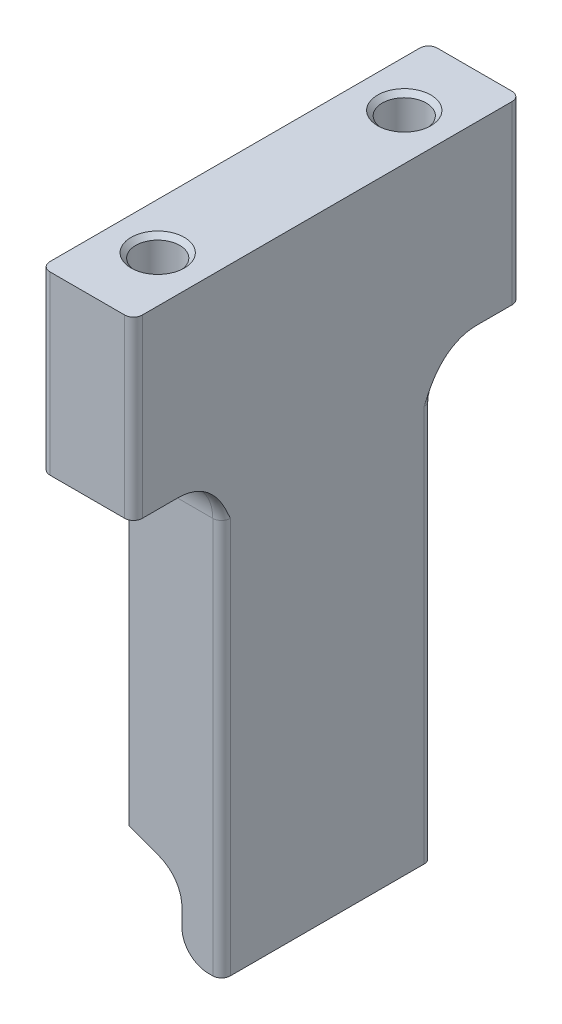
ISO-10303-21;
HEADER;
FILE_DESCRIPTION(('STEP AP214'),'2;1');
FILE_NAME('part.step','',(''),(''),'','','');
FILE_SCHEMA(('AUTOMOTIVE_DESIGN { 1 0 10303 214 1 1 1 1 }'));
ENDSEC;
DATA;
#1=APPLICATION_CONTEXT('core data for automotive mechanical design processes');
#2=APPLICATION_PROTOCOL_DEFINITION('international standard','automotive_design',2000,#1);
#3=PRODUCT_CONTEXT('',#1,'mechanical');
#4=PRODUCT('Part','Part','',(#3));
#5=PRODUCT_RELATED_PRODUCT_CATEGORY('part','',(#4));
#6=PRODUCT_DEFINITION_FORMATION('','',#4);
#7=PRODUCT_DEFINITION_CONTEXT('part definition',#1,'design');
#8=PRODUCT_DEFINITION('design','',#6,#7);
#9=PRODUCT_DEFINITION_SHAPE('','',#8);
#10=(LENGTH_UNIT() NAMED_UNIT(*) SI_UNIT(.MILLI.,.METRE.));
#11=(NAMED_UNIT(*) PLANE_ANGLE_UNIT() SI_UNIT($,.RADIAN.));
#12=(NAMED_UNIT(*) SI_UNIT($,.STERADIAN.) SOLID_ANGLE_UNIT());
#13=UNCERTAINTY_MEASURE_WITH_UNIT(LENGTH_MEASURE(1.E-05),#10,'distance_accuracy_value','');
#14=(GEOMETRIC_REPRESENTATION_CONTEXT(3) GLOBAL_UNCERTAINTY_ASSIGNED_CONTEXT((#13)) GLOBAL_UNIT_ASSIGNED_CONTEXT((#10,
#11,#12)) REPRESENTATION_CONTEXT('',''));
#15=CARTESIAN_POINT('',(0.,0.,0.));
#16=DIRECTION('',(0.,0.,1.));
#17=DIRECTION('',(1.,0.,0.));
#18=AXIS2_PLACEMENT_3D('',#15,#16,#17);
#19=CARTESIAN_POINT('',(5.25,-70.,12.));
#20=DIRECTION('',(1.,0.,0.));
#21=DIRECTION('',(0.,0.,-1.));
#22=AXIS2_PLACEMENT_3D('',#19,#20,#21);
#23=PLANE('',#22);
#24=DIRECTION('',(0.,0.,-1.));
#25=VECTOR('',#24,1.);
#26=CARTESIAN_POINT('',(5.25,-20.,22.));
#27=LINE('',#26,#25);
#28=CARTESIAN_POINT('',(5.25,-20.,-16.9160797830996));
#29=VERTEX_POINT('',#28);
#30=CARTESIAN_POINT('',(5.25,-20.,-21.));
#31=VERTEX_POINT('',#30);
#32=EDGE_CURVE('E232',#29,#31,#27,.T.);
#33=ORIENTED_EDGE('',*,*,#32,.T.);
#34=DIRECTION('',(0.,1.,0.));
#35=VECTOR('',#34,1.);
#36=CARTESIAN_POINT('',(5.25,-70.,-21.));
#37=LINE('',#36,#35);
#38=CARTESIAN_POINT('',(5.25,0.,-21.));
#39=VERTEX_POINT('',#38);
#40=EDGE_CURVE('E398',#31,#39,#37,.T.);
#41=ORIENTED_EDGE('',*,*,#40,.T.);
#42=DIRECTION('',(0.,0.,-1.));
#43=VECTOR('',#42,1.);
#44=CARTESIAN_POINT('',(5.25,0.,12.));
#45=LINE('',#44,#43);
#46=CARTESIAN_POINT('',(5.25,0.,21.));
#47=VERTEX_POINT('',#46);
#48=EDGE_CURVE('E262',#47,#39,#45,.T.);
#49=ORIENTED_EDGE('',*,*,#48,.F.);
#50=DIRECTION('',(0.,1.,0.));
#51=VECTOR('',#50,1.);
#52=CARTESIAN_POINT('',(5.25,-70.,21.));
#53=LINE('',#52,#51);
#54=CARTESIAN_POINT('',(5.25,-20.,21.));
#55=VERTEX_POINT('',#54);
#56=EDGE_CURVE('E407',#47,#55,#53,.F.);
#57=ORIENTED_EDGE('',*,*,#56,.T.);
#58=CARTESIAN_POINT('',(5.25,-20.,16.9160797830996));
#59=VERTEX_POINT('',#58);
#60=EDGE_CURVE('E233',#55,#59,#27,.T.);
#61=ORIENTED_EDGE('',*,*,#60,.T.);
#62=CARTESIAN_POINT('',(5.25,-20.,16.9160797830996));
#63=CARTESIAN_POINT('',(5.25,-19.9999894901637,16.7891695359213));
#64=CARTESIAN_POINT('',(5.25,-20.0046970896311,16.6622657436725));
#65=CARTESIAN_POINT('',(5.25,-20.0234197172249,16.4091760112215));
#66=CARTESIAN_POINT('',(5.25,-20.0374325325279,16.2829899075432));
#67=CARTESIAN_POINT('',(5.25,-20.0746133928977,16.0321382318218));
#68=CARTESIAN_POINT('',(5.25,-20.0977698376197,15.9074709386826));
#69=CARTESIAN_POINT('',(5.25,-20.1530395735266,15.6601280415763));
#70=CARTESIAN_POINT('',(5.25,-20.185153932505,15.5374526768954));
#71=CARTESIAN_POINT('',(5.25,-20.2637105050361,15.2760107259621));
#72=CARTESIAN_POINT('',(5.25,-20.3115977571874,15.1376763074849));
#73=CARTESIAN_POINT('',(5.25,-20.4185117721562,14.8653178215435));
#74=CARTESIAN_POINT('',(5.25,-20.4775437349829,14.7312958005043));
#75=CARTESIAN_POINT('',(5.25,-20.6061821958586,14.4683767448541));
#76=CARTESIAN_POINT('',(5.25,-20.6757921594758,14.339481407375));
#77=CARTESIAN_POINT('',(5.25,-20.8248846333417,14.0876061526278));
#78=CARTESIAN_POINT('',(5.25,-20.9043635997168,13.9646241338185));
#79=CARTESIAN_POINT('',(5.25,-21.0766525358194,13.719155163343));
#80=CARTESIAN_POINT('',(5.25,-21.1699281389003,13.5969951979272));
#81=CARTESIAN_POINT('',(5.25,-21.3656448948461,13.360262363442));
#82=CARTESIAN_POINT('',(5.25,-21.4680865077264,13.2456898756687));
#83=CARTESIAN_POINT('',(5.25,-21.6811413825091,13.0244401523157));
#84=CARTESIAN_POINT('',(5.25,-21.7917542565157,12.917762542441));
#85=CARTESIAN_POINT('',(5.25,-22.020102906717,12.7123795001146));
#86=CARTESIAN_POINT('',(5.25,-22.1378383083502,12.6136736490781));
#87=CARTESIAN_POINT('',(5.25,-22.4617725369814,12.3594319148424));
#88=CARTESIAN_POINT('',(5.25,-22.6735779800598,12.2110094388895));
#89=CARTESIAN_POINT('',(5.25,-23.1093908502497,11.9338674346655));
#90=CARTESIAN_POINT('',(5.25,-23.3333957918585,11.8051439131775));
#91=CARTESIAN_POINT('',(5.25,-23.7607716798599,11.5776576901539));
#92=CARTESIAN_POINT('',(5.25,-23.9632380899574,11.477160192975));
#93=CARTESIAN_POINT('',(5.25,-24.3714755228196,11.2831245387175));
#94=CARTESIAN_POINT('',(5.25000000000001,-24.5772473138215,11.1895880288219));
#95=CARTESIAN_POINT('',(5.25,-24.8512847355008,11.0665151322438));
#96=CARTESIAN_POINT('',(5.25,-24.9191859075108,11.0361416208077));
#97=CARTESIAN_POINT('',(5.25,-24.9913933692119,11.003849004667));
#98=CARTESIAN_POINT('',(5.25,-24.9956966838616,11.0019245037049));
#99=CARTESIAN_POINT('',(5.25,-25.,11.));
#100=B_SPLINE_CURVE_WITH_KNOTS('',3,(#62,#63,#64,#65,#66,#67,#68,#69,#70,#71,#72,#73,#74,#75,
#76,#77,#78,#79,#80,#81,#82,#83,#84,#85,#86,#87,#88,#89,#90,#91,#92,#93,#94,#95,#96,#97,#98,
#99),.UNSPECIFIED.,.F.,.F.,(4,2,2,2,2,2,2,2,2,2,2,2,2,2,2,2,2,2,4),(0.,0.380633696246959,
0.761176908442176,1.14123887609861,1.52134616694543,1.96000481777713,2.39886865041611,
2.83787657499773,3.2767273090638,3.73734073447595,4.19797728972743,4.65859199225861,
5.11918249286643,5.89366486615118,6.66799003390906,7.34588228650388,8.02393444246643,
8.24709091180318,8.26123304742583),.UNSPECIFIED.);
#101=CARTESIAN_POINT('',(5.25,-25.,11.));
#102=VERTEX_POINT('',#101);
#103=EDGE_CURVE('E337',#59,#102,#100,.T.);
#104=ORIENTED_EDGE('',*,*,#103,.T.);
#105=DIRECTION('',(0.,1.,0.));
#106=VECTOR('',#105,1.);
#107=CARTESIAN_POINT('',(5.25,-70.,11.));
#108=LINE('',#107,#106);
#109=CARTESIAN_POINT('',(5.25,-70.,11.));
#110=VERTEX_POINT('',#109);
#111=EDGE_CURVE('E296',#102,#110,#108,.F.);
#112=ORIENTED_EDGE('',*,*,#111,.T.);
#113=DIRECTION('',(0.,0.,-1.));
#114=VECTOR('',#113,1.);
#115=CARTESIAN_POINT('',(5.25,-70.,12.));
#116=LINE('',#115,#114);
#117=CARTESIAN_POINT('',(5.25,-70.,-11.));
#118=VERTEX_POINT('',#117);
#119=EDGE_CURVE('E267',#110,#118,#116,.T.);
#120=ORIENTED_EDGE('',*,*,#119,.T.);
#121=DIRECTION('',(0.,1.,0.));
#122=VECTOR('',#121,1.);
#123=CARTESIAN_POINT('',(5.25,-70.,-11.));
#124=LINE('',#123,#122);
#125=CARTESIAN_POINT('',(5.25,-25.,-11.));
#126=VERTEX_POINT('',#125);
#127=EDGE_CURVE('E298',#118,#126,#124,.T.);
#128=ORIENTED_EDGE('',*,*,#127,.T.);
#129=CARTESIAN_POINT('',(5.25,-20.,-16.9160797830996));
#130=CARTESIAN_POINT('',(5.25,-19.9999894901637,-16.7891695359213));
#131=CARTESIAN_POINT('',(5.25,-20.0046970896311,-16.6622657436725));
#132=CARTESIAN_POINT('',(5.25,-20.0234197172249,-16.4091760112215));
#133=CARTESIAN_POINT('',(5.25,-20.0374325325279,-16.2829899075432));
#134=CARTESIAN_POINT('',(5.25,-20.0746133928977,-16.0321382318218));
#135=CARTESIAN_POINT('',(5.25,-20.0977698376197,-15.9074709386826));
#136=CARTESIAN_POINT('',(5.25,-20.1530395735266,-15.6601280415764));
#137=CARTESIAN_POINT('',(5.25,-20.185153932505,-15.5374526768954));
#138=CARTESIAN_POINT('',(5.25,-20.2637105050361,-15.2760107259621));
#139=CARTESIAN_POINT('',(5.25,-20.3115977571874,-15.1376763074849));
#140=CARTESIAN_POINT('',(5.25,-20.4185117721562,-14.8653178215435));
#141=CARTESIAN_POINT('',(5.25,-20.4775437349829,-14.7312958005043));
#142=CARTESIAN_POINT('',(5.25,-20.6061821958586,-14.4683767448541));
#143=CARTESIAN_POINT('',(5.25,-20.6757921594758,-14.339481407375));
#144=CARTESIAN_POINT('',(5.25,-20.8248846333417,-14.0876061526278));
#145=CARTESIAN_POINT('',(5.25,-20.9043635997168,-13.9646241338185));
#146=CARTESIAN_POINT('',(5.25,-21.0766525358194,-13.719155163343));
#147=CARTESIAN_POINT('',(5.25,-21.1699281389003,-13.5969951979272));
#148=CARTESIAN_POINT('',(5.25,-21.365644894846,-13.360262363442));
#149=CARTESIAN_POINT('',(5.25,-21.4680865077264,-13.2456898756688));
#150=CARTESIAN_POINT('',(5.25,-21.6811413825091,-13.0244401523158));
#151=CARTESIAN_POINT('',(5.25,-21.7917542565157,-12.917762542441));
#152=CARTESIAN_POINT('',(5.25,-22.020102906717,-12.7123795001146));
#153=CARTESIAN_POINT('',(5.25,-22.1378383083502,-12.6136736490781));
#154=CARTESIAN_POINT('',(5.25,-22.4617725369814,-12.3594319148424));
#155=CARTESIAN_POINT('',(5.25,-22.6735779800599,-12.2110094388894));
#156=CARTESIAN_POINT('',(5.25,-23.1093908502498,-11.9338674346655));
#157=CARTESIAN_POINT('',(5.25,-23.3333957918586,-11.8051439131776));
#158=CARTESIAN_POINT('',(5.25,-23.7607716798599,-11.5776576901539));
#159=CARTESIAN_POINT('',(5.25,-23.9632380899572,-11.4771601929747));
#160=CARTESIAN_POINT('',(5.25,-24.3714755228197,-11.2831245387178));
#161=CARTESIAN_POINT('',(5.25,-24.5772473138219,-11.1895880288229));
#162=CARTESIAN_POINT('',(5.25,-24.8512847355007,-11.0665151322435));
#163=CARTESIAN_POINT('',(5.25,-24.9191859075104,-11.0361416208068));
#164=CARTESIAN_POINT('',(5.25,-24.9913933692118,-11.0038490046669));
#165=CARTESIAN_POINT('',(5.25,-24.9956966838616,-11.0019245037049));
#166=CARTESIAN_POINT('',(5.25,-25.,-11.));
#167=B_SPLINE_CURVE_WITH_KNOTS('',3,(#129,#130,#131,#132,#133,#134,#135,#136,#137,#138,#139,
#140,#141,#142,#143,#144,#145,#146,#147,#148,#149,#150,#151,#152,#153,#154,#155,#156,#157,#158,
#159,#160,#161,#162,#163,#164,#165,#166),.UNSPECIFIED.,.F.,.F.,(4,2,2,2,2,2,2,2,2,2,2,2,2,2,2,2,
2,2,4),(0.,0.380633696246945,0.761176908442148,1.14123887609859,1.52134616694543,
1.96000481777714,2.39886865041613,2.83787657499774,3.2767273090638,3.73734073447593,
4.19797728972739,4.65859199225859,5.11918249286643,5.89366486615124,6.66799003390907,
7.34588228650386,8.02393444246643,8.24709091180318,8.26123304742583),.UNSPECIFIED.);
#168=EDGE_CURVE('E329',#126,#29,#167,.F.);
#169=ORIENTED_EDGE('',*,*,#168,.T.);
#170=EDGE_LOOP('',(#33,#41,#49,#57,#61,#104,#112,#120,#128,#169));
#171=FACE_BOUND('',#170,.T.);
#172=ADVANCED_FACE('F53',(#171),#23,.T.);
#173=CARTESIAN_POINT('',(-5.25,-70.,12.));
#174=DIRECTION('',(0.,0.,1.));
#175=DIRECTION('',(1.,0.,0.));
#176=AXIS2_PLACEMENT_3D('',#173,#174,#175);
#177=PLANE('',#176);
#178=DIRECTION('',(0.,1.,0.));
#179=VECTOR('',#178,1.);
#180=CARTESIAN_POINT('',(4.25,-70.,12.));
#181=LINE('',#180,#179);
#182=CARTESIAN_POINT('',(4.25,-70.,12.));
#183=VERTEX_POINT('',#182);
#184=CARTESIAN_POINT('',(4.25,-25.,12.));
#185=VERTEX_POINT('',#184);
#186=EDGE_CURVE('E307',#183,#185,#181,.T.);
#187=ORIENTED_EDGE('',*,*,#186,.T.);
#188=DIRECTION('',(1.,0.,0.));
#189=VECTOR('',#188,1.);
#190=CARTESIAN_POINT('',(-5.25,-25.,12.));
#191=LINE('',#190,#189);
#192=CARTESIAN_POINT('',(-5.25,-25.,12.));
#193=VERTEX_POINT('',#192);
#194=EDGE_CURVE('E327',#185,#193,#191,.F.);
#195=ORIENTED_EDGE('',*,*,#194,.T.);
#196=DIRECTION('',(0.,1.,0.));
#197=VECTOR('',#196,1.);
#198=CARTESIAN_POINT('',(-5.25,-70.,12.));
#199=LINE('',#198,#197);
#200=CARTESIAN_POINT('',(-5.25,-60.015348441564,12.));
#201=VERTEX_POINT('',#200);
#202=EDGE_CURVE('E281',#201,#193,#199,.T.);
#203=ORIENTED_EDGE('',*,*,#202,.F.);
#204=DIRECTION('',(-0.939692620785908,0.342020143325669,0.));
#205=VECTOR('',#204,1.);
#206=CARTESIAN_POINT('',(-1.88191942669732,-61.2412295168564,12.));
#207=LINE('',#206,#205);
#208=CARTESIAN_POINT('',(-1.88191942669732,-61.2412295168564,12.));
#209=VERTEX_POINT('',#208);
#210=EDGE_CURVE('E256',#209,#201,#207,.T.);
#211=ORIENTED_EDGE('',*,*,#210,.F.);
#212=CARTESIAN_POINT('',(-3.25,-65.,12.));
#213=DIRECTION('',(0.,0.,1.));
#214=DIRECTION('',(1.,0.,0.));
#215=AXIS2_PLACEMENT_3D('',#212,#213,#214);
#216=CIRCLE('',#215,4.);
#217=CARTESIAN_POINT('',(0.749999999999999,-65.,12.));
#218=VERTEX_POINT('',#217);
#219=EDGE_CURVE('E253',#218,#209,#216,.T.);
#220=ORIENTED_EDGE('',*,*,#219,.F.);
#221=DIRECTION('',(0.,1.,0.));
#222=VECTOR('',#221,1.);
#223=CARTESIAN_POINT('',(0.749999999999999,-65.,12.));
#224=LINE('',#223,#222);
#225=CARTESIAN_POINT('',(0.75,-67.,12.));
#226=VERTEX_POINT('',#225);
#227=EDGE_CURVE('E251',#226,#218,#224,.T.);
#228=ORIENTED_EDGE('',*,*,#227,.F.);
#229=CARTESIAN_POINT('',(3.75,-67.,12.));
#230=DIRECTION('',(0.,0.,1.));
#231=DIRECTION('',(1.,0.,0.));
#232=AXIS2_PLACEMENT_3D('',#229,#230,#231);
#233=CIRCLE('',#232,3.);
#234=CARTESIAN_POINT('',(3.75,-70.,12.));
#235=VERTEX_POINT('',#234);
#236=EDGE_CURVE('E289',#226,#235,#233,.T.);
#237=ORIENTED_EDGE('',*,*,#236,.T.);
#238=DIRECTION('',(1.,0.,0.));
#239=VECTOR('',#238,1.);
#240=CARTESIAN_POINT('',(-5.25,-70.,12.));
#241=LINE('',#240,#239);
#242=EDGE_CURVE('E273',#235,#183,#241,.T.);
#243=ORIENTED_EDGE('',*,*,#242,.T.);
#244=EDGE_LOOP('',(#187,#195,#203,#211,#220,#228,#237,#243));
#245=FACE_BOUND('',#244,.T.);
#246=ADVANCED_FACE('F384',(#245),#177,.T.);
#247=CARTESIAN_POINT('',(-5.25,-70.,12.));
#248=DIRECTION('',(-1.,0.,0.));
#249=DIRECTION('',(0.,0.,1.));
#250=AXIS2_PLACEMENT_3D('',#247,#248,#249);
#251=PLANE('',#250);
#252=DIRECTION('',(0.,0.,1.));
#253=VECTOR('',#252,1.);
#254=CARTESIAN_POINT('',(-5.25,0.,12.));
#255=LINE('',#254,#253);
#256=CARTESIAN_POINT('',(-5.25,0.,-21.));
#257=VERTEX_POINT('',#256);
#258=CARTESIAN_POINT('',(-5.25,0.,21.));
#259=VERTEX_POINT('',#258);
#260=EDGE_CURVE('E271',#257,#259,#255,.T.);
#261=ORIENTED_EDGE('',*,*,#260,.F.);
#262=DIRECTION('',(0.,1.,0.));
#263=VECTOR('',#262,1.);
#264=CARTESIAN_POINT('',(-5.25,-70.,-21.));
#265=LINE('',#264,#263);
#266=CARTESIAN_POINT('',(-5.25,-20.,-21.));
#267=VERTEX_POINT('',#266);
#268=EDGE_CURVE('E417',#257,#267,#265,.F.);
#269=ORIENTED_EDGE('',*,*,#268,.T.);
#270=DIRECTION('',(0.,0.,1.));
#271=VECTOR('',#270,1.);
#272=CARTESIAN_POINT('',(-5.25,-20.,22.));
#273=LINE('',#272,#271);
#274=CARTESIAN_POINT('',(-5.25,-20.,-17.));
#275=VERTEX_POINT('',#274);
#276=EDGE_CURVE('E227',#267,#275,#273,.T.);
#277=ORIENTED_EDGE('',*,*,#276,.T.);
#278=CARTESIAN_POINT('',(-5.25,-25.,-17.));
#279=DIRECTION('',(-1.,0.,0.));
#280=DIRECTION('',(0.,0.,1.));
#281=AXIS2_PLACEMENT_3D('',#278,#279,#280);
#282=CIRCLE('',#281,5.);
#283=CARTESIAN_POINT('',(-5.25,-25.,-12.));
#284=VERTEX_POINT('',#283);
#285=EDGE_CURVE('E440',#275,#284,#282,.F.);
#286=ORIENTED_EDGE('',*,*,#285,.T.);
#287=DIRECTION('',(0.,1.,0.));
#288=VECTOR('',#287,1.);
#289=CARTESIAN_POINT('',(-5.25,-70.,-12.));
#290=LINE('',#289,#288);
#291=CARTESIAN_POINT('',(-5.25,-60.015348441564,-12.));
#292=VERTEX_POINT('',#291);
#293=EDGE_CURVE('E276',#292,#284,#290,.T.);
#294=ORIENTED_EDGE('',*,*,#293,.F.);
#295=DIRECTION('',(0.,0.,1.));
#296=VECTOR('',#295,1.);
#297=CARTESIAN_POINT('',(-5.25,-60.015348441564,-12.001));
#298=LINE('',#297,#296);
#299=EDGE_CURVE('E259',#292,#201,#298,.T.);
#300=ORIENTED_EDGE('',*,*,#299,.T.);
#301=ORIENTED_EDGE('',*,*,#202,.T.);
#302=CARTESIAN_POINT('',(-5.25,-25.,17.));
#303=DIRECTION('',(-1.,0.,0.));
#304=DIRECTION('',(0.,0.,1.));
#305=AXIS2_PLACEMENT_3D('',#302,#303,#304);
#306=CIRCLE('',#305,5.);
#307=CARTESIAN_POINT('',(-5.25,-20.,17.));
#308=VERTEX_POINT('',#307);
#309=EDGE_CURVE('E434',#193,#308,#306,.F.);
#310=ORIENTED_EDGE('',*,*,#309,.T.);
#311=CARTESIAN_POINT('',(-5.25,-20.,21.));
#312=VERTEX_POINT('',#311);
#313=EDGE_CURVE('E230',#308,#312,#273,.T.);
#314=ORIENTED_EDGE('',*,*,#313,.T.);
#315=DIRECTION('',(0.,1.,0.));
#316=VECTOR('',#315,1.);
#317=CARTESIAN_POINT('',(-5.25,-70.,21.));
#318=LINE('',#317,#316);
#319=EDGE_CURVE('E419',#312,#259,#318,.T.);
#320=ORIENTED_EDGE('',*,*,#319,.T.);
#321=EDGE_LOOP('',(#261,#269,#277,#286,#294,#300,#301,#310,#314,#320));
#322=FACE_BOUND('',#321,.T.);
#323=ADVANCED_FACE('F390',(#322),#251,.T.);
#324=CARTESIAN_POINT('',(-5.25,-70.,-12.));
#325=DIRECTION('',(0.,0.,-1.));
#326=DIRECTION('',(-1.,0.,0.));
#327=AXIS2_PLACEMENT_3D('',#324,#325,#326);
#328=PLANE('',#327);
#329=ORIENTED_EDGE('',*,*,#293,.T.);
#330=DIRECTION('',(-1.,0.,0.));
#331=VECTOR('',#330,1.);
#332=CARTESIAN_POINT('',(4.25,-25.,-12.));
#333=LINE('',#332,#331);
#334=CARTESIAN_POINT('',(4.25,-25.,-12.));
#335=VERTEX_POINT('',#334);
#336=EDGE_CURVE('E325',#284,#335,#333,.F.);
#337=ORIENTED_EDGE('',*,*,#336,.T.);
#338=DIRECTION('',(0.,1.,0.));
#339=VECTOR('',#338,1.);
#340=CARTESIAN_POINT('',(4.25,-70.,-12.));
#341=LINE('',#340,#339);
#342=CARTESIAN_POINT('',(4.25,-70.,-12.));
#343=VERTEX_POINT('',#342);
#344=EDGE_CURVE('E301',#335,#343,#341,.F.);
#345=ORIENTED_EDGE('',*,*,#344,.T.);
#346=DIRECTION('',(-1.,0.,0.));
#347=VECTOR('',#346,1.);
#348=CARTESIAN_POINT('',(-5.25,-70.,-12.));
#349=LINE('',#348,#347);
#350=CARTESIAN_POINT('',(3.75,-70.,-12.));
#351=VERTEX_POINT('',#350);
#352=EDGE_CURVE('E270',#343,#351,#349,.T.);
#353=ORIENTED_EDGE('',*,*,#352,.T.);
#354=CARTESIAN_POINT('',(3.75,-67.,-12.));
#355=DIRECTION('',(0.,0.,-1.));
#356=DIRECTION('',(-1.,0.,0.));
#357=AXIS2_PLACEMENT_3D('',#354,#355,#356);
#358=CIRCLE('',#357,3.);
#359=CARTESIAN_POINT('',(0.75,-67.,-12.));
#360=VERTEX_POINT('',#359);
#361=EDGE_CURVE('E294',#351,#360,#358,.T.);
#362=ORIENTED_EDGE('',*,*,#361,.T.);
#363=DIRECTION('',(0.,1.,0.));
#364=VECTOR('',#363,1.);
#365=CARTESIAN_POINT('',(0.749999999999999,-65.,-12.));
#366=LINE('',#365,#364);
#367=CARTESIAN_POINT('',(0.749999999999999,-65.,-12.));
#368=VERTEX_POINT('',#367);
#369=EDGE_CURVE('E238',#360,#368,#366,.T.);
#370=ORIENTED_EDGE('',*,*,#369,.T.);
#371=CARTESIAN_POINT('',(-3.25,-65.,-12.));
#372=DIRECTION('',(0.,0.,-1.));
#373=DIRECTION('',(-1.,0.,0.));
#374=AXIS2_PLACEMENT_3D('',#371,#372,#373);
#375=CIRCLE('',#374,4.);
#376=CARTESIAN_POINT('',(-1.88191942669732,-61.2412295168564,-12.));
#377=VERTEX_POINT('',#376);
#378=EDGE_CURVE('E245',#368,#377,#375,.F.);
#379=ORIENTED_EDGE('',*,*,#378,.T.);
#380=DIRECTION('',(-0.939692620785908,0.342020143325669,0.));
#381=VECTOR('',#380,1.);
#382=CARTESIAN_POINT('',(-1.88191942669732,-61.2412295168564,-12.));
#383=LINE('',#382,#381);
#384=EDGE_CURVE('E248',#377,#292,#383,.T.);
#385=ORIENTED_EDGE('',*,*,#384,.T.);
#386=EDGE_LOOP('',(#329,#337,#345,#353,#362,#370,#379,#385));
#387=FACE_BOUND('',#386,.T.);
#388=ADVANCED_FACE('F465',(#387),#328,.T.);
#389=CARTESIAN_POINT('',(0.,-70.,0.));
#390=DIRECTION('',(0.,-1.,0.));
#391=DIRECTION('',(0.,0.,-1.));
#392=AXIS2_PLACEMENT_3D('',#389,#390,#391);
#393=PLANE('',#392);
#394=ORIENTED_EDGE('',*,*,#352,.F.);
#395=CARTESIAN_POINT('',(4.25,-70.,-11.));
#396=DIRECTION('',(0.,-1.,0.));
#397=DIRECTION('',(0.,0.,-1.));
#398=AXIS2_PLACEMENT_3D('',#395,#396,#397);
#399=CIRCLE('',#398,1.);
#400=EDGE_CURVE('E305',#343,#118,#399,.T.);
#401=ORIENTED_EDGE('',*,*,#400,.T.);
#402=ORIENTED_EDGE('',*,*,#119,.F.);
#403=CARTESIAN_POINT('',(4.25,-70.,11.));
#404=DIRECTION('',(0.,-1.,0.));
#405=DIRECTION('',(0.,0.,-1.));
#406=AXIS2_PLACEMENT_3D('',#403,#404,#405);
#407=CIRCLE('',#406,1.);
#408=EDGE_CURVE('E303',#110,#183,#407,.T.);
#409=ORIENTED_EDGE('',*,*,#408,.T.);
#410=ORIENTED_EDGE('',*,*,#242,.F.);
#411=DIRECTION('',(0.,0.,1.));
#412=VECTOR('',#411,1.);
#413=CARTESIAN_POINT('',(3.75,-70.,-12.));
#414=LINE('',#413,#412);
#415=EDGE_CURVE('E291',#235,#351,#414,.F.);
#416=ORIENTED_EDGE('',*,*,#415,.T.);
#417=EDGE_LOOP('',(#394,#401,#402,#409,#410,#416));
#418=FACE_BOUND('',#417,.T.);
#419=ADVANCED_FACE('F482',(#418),#393,.T.);
#420=CARTESIAN_POINT('',(0.,0.,0.));
#421=DIRECTION('',(0.,-1.,0.));
#422=DIRECTION('',(0.,0.,-1.));
#423=AXIS2_PLACEMENT_3D('',#420,#421,#422);
#424=PLANE('',#423);
#425=CARTESIAN_POINT('',(0.,0.,-14.));
#426=DIRECTION('',(0.,1.,0.));
#427=DIRECTION('',(0.,0.,1.));
#428=AXIS2_PLACEMENT_3D('',#425,#426,#427);
#429=CIRCLE('',#428,3.025);
#430=CARTESIAN_POINT('',(0.,0.,-10.975));
#431=VERTEX_POINT('',#430);
#432=EDGE_CURVE('E217',#431,#431,#429,.T.);
#433=ORIENTED_EDGE('',*,*,#432,.F.);
#434=EDGE_LOOP('',(#433));
#435=FACE_BOUND('',#434,.T.);
#436=CARTESIAN_POINT('',(0.,0.,14.));
#437=DIRECTION('',(0.,1.,0.));
#438=DIRECTION('',(0.,0.,1.));
#439=AXIS2_PLACEMENT_3D('',#436,#437,#438);
#440=CIRCLE('',#439,3.025);
#441=CARTESIAN_POINT('',(0.,0.,17.025));
#442=VERTEX_POINT('',#441);
#443=EDGE_CURVE('E210',#442,#442,#440,.T.);
#444=ORIENTED_EDGE('',*,*,#443,.F.);
#445=EDGE_LOOP('',(#444));
#446=FACE_BOUND('',#445,.T.);
#447=DIRECTION('',(-1.,0.,0.));
#448=VECTOR('',#447,1.);
#449=CARTESIAN_POINT('',(-5.25,0.,-22.));
#450=LINE('',#449,#448);
#451=CARTESIAN_POINT('',(4.25,0.,-22.));
#452=VERTEX_POINT('',#451);
#453=CARTESIAN_POINT('',(-4.25,0.,-22.));
#454=VERTEX_POINT('',#453);
#455=EDGE_CURVE('E241',#452,#454,#450,.T.);
#456=ORIENTED_EDGE('',*,*,#455,.T.);
#457=CARTESIAN_POINT('',(-4.25,0.,-21.));
#458=DIRECTION('',(0.,-1.,0.));
#459=DIRECTION('',(0.,0.,-1.));
#460=AXIS2_PLACEMENT_3D('',#457,#458,#459);
#461=CIRCLE('',#460,1.);
#462=EDGE_CURVE('E422',#454,#257,#461,.F.);
#463=ORIENTED_EDGE('',*,*,#462,.T.);
#464=ORIENTED_EDGE('',*,*,#260,.T.);
#465=CARTESIAN_POINT('',(-4.25,0.,21.));
#466=DIRECTION('',(0.,-1.,0.));
#467=DIRECTION('',(0.,0.,-1.));
#468=AXIS2_PLACEMENT_3D('',#465,#466,#467);
#469=CIRCLE('',#468,1.);
#470=CARTESIAN_POINT('',(-4.25,0.,22.));
#471=VERTEX_POINT('',#470);
#472=EDGE_CURVE('E425',#259,#471,#469,.F.);
#473=ORIENTED_EDGE('',*,*,#472,.T.);
#474=DIRECTION('',(1.,0.,0.));
#475=VECTOR('',#474,1.);
#476=CARTESIAN_POINT('',(-5.25,0.,22.));
#477=LINE('',#476,#475);
#478=CARTESIAN_POINT('',(4.25,0.,22.));
#479=VERTEX_POINT('',#478);
#480=EDGE_CURVE('E226',#471,#479,#477,.T.);
#481=ORIENTED_EDGE('',*,*,#480,.T.);
#482=CARTESIAN_POINT('',(4.25,0.,21.));
#483=DIRECTION('',(0.,-1.,0.));
#484=DIRECTION('',(0.,0.,-1.));
#485=AXIS2_PLACEMENT_3D('',#482,#483,#484);
#486=CIRCLE('',#485,1.);
#487=EDGE_CURVE('E427',#479,#47,#486,.F.);
#488=ORIENTED_EDGE('',*,*,#487,.T.);
#489=ORIENTED_EDGE('',*,*,#48,.T.);
#490=CARTESIAN_POINT('',(4.25,0.,-21.));
#491=DIRECTION('',(0.,-1.,0.));
#492=DIRECTION('',(0.,0.,-1.));
#493=AXIS2_PLACEMENT_3D('',#490,#491,#492);
#494=CIRCLE('',#493,1.);
#495=EDGE_CURVE('E405',#39,#452,#494,.F.);
#496=ORIENTED_EDGE('',*,*,#495,.T.);
#497=EDGE_LOOP('',(#456,#463,#464,#473,#481,#488,#489,#496));
#498=FACE_BOUND('',#497,.T.);
#499=ADVANCED_FACE('F503',(#435,#446,#498),#424,.F.);
#500=CARTESIAN_POINT('',(-1.88191942669732,-61.2412295168564,-12.001));
#501=DIRECTION('',(0.342020143325669,0.939692620785908,0.));
#502=DIRECTION('',(-0.939692620785908,0.342020143325669,0.));
#503=AXIS2_PLACEMENT_3D('',#500,#501,#502);
#504=PLANE('',#503);
#505=DIRECTION('',(0.,0.,1.));
#506=VECTOR('',#505,1.);
#507=CARTESIAN_POINT('',(-1.88191942669732,-61.2412295168564,-12.001));
#508=LINE('',#507,#506);
#509=EDGE_CURVE('E263',#377,#209,#508,.T.);
#510=ORIENTED_EDGE('',*,*,#509,.T.);
#511=ORIENTED_EDGE('',*,*,#210,.T.);
#512=ORIENTED_EDGE('',*,*,#299,.F.);
#513=ORIENTED_EDGE('',*,*,#384,.F.);
#514=EDGE_LOOP('',(#510,#511,#512,#513));
#515=FACE_BOUND('',#514,.T.);
#516=ADVANCED_FACE('F462',(#515),#504,.F.);
#517=CARTESIAN_POINT('',(-3.25,-65.,-12.001));
#518=DIRECTION('',(0.,0.,1.));
#519=DIRECTION('',(1.,0.,0.));
#520=AXIS2_PLACEMENT_3D('',#517,#518,#519);
#521=CYLINDRICAL_SURFACE('',#520,4.);
#522=DIRECTION('',(0.,0.,1.));
#523=VECTOR('',#522,1.);
#524=CARTESIAN_POINT('',(0.749999999999999,-65.,-12.001));
#525=LINE('',#524,#523);
#526=EDGE_CURVE('E258',#368,#218,#525,.T.);
#527=ORIENTED_EDGE('',*,*,#526,.T.);
#528=ORIENTED_EDGE('',*,*,#219,.T.);
#529=ORIENTED_EDGE('',*,*,#509,.F.);
#530=ORIENTED_EDGE('',*,*,#378,.F.);
#531=EDGE_LOOP('',(#527,#528,#529,#530));
#532=FACE_BOUND('',#531,.T.);
#533=ADVANCED_FACE('F471',(#532),#521,.F.);
#534=CARTESIAN_POINT('',(0.749999999999999,-65.,-12.001));
#535=DIRECTION('',(1.,0.,0.));
#536=DIRECTION('',(0.,1.,0.));
#537=AXIS2_PLACEMENT_3D('',#534,#535,#536);
#538=PLANE('',#537);
#539=ORIENTED_EDGE('',*,*,#369,.F.);
#540=DIRECTION('',(0.,0.,1.));
#541=VECTOR('',#540,1.);
#542=CARTESIAN_POINT('',(0.75,-67.,12.));
#543=LINE('',#542,#541);
#544=EDGE_CURVE('E284',#360,#226,#543,.T.);
#545=ORIENTED_EDGE('',*,*,#544,.T.);
#546=ORIENTED_EDGE('',*,*,#227,.T.);
#547=ORIENTED_EDGE('',*,*,#526,.F.);
#548=EDGE_LOOP('',(#539,#545,#546,#547));
#549=FACE_BOUND('',#548,.T.);
#550=ADVANCED_FACE('F474',(#549),#538,.F.);
#551=CARTESIAN_POINT('',(3.75,-67.,-12.001));
#552=DIRECTION('',(0.,0.,-1.));
#553=DIRECTION('',(-1.,0.,0.));
#554=AXIS2_PLACEMENT_3D('',#551,#552,#553);
#555=CYLINDRICAL_SURFACE('',#554,3.);
#556=ORIENTED_EDGE('',*,*,#361,.F.);
#557=ORIENTED_EDGE('',*,*,#415,.F.);
#558=ORIENTED_EDGE('',*,*,#236,.F.);
#559=ORIENTED_EDGE('',*,*,#544,.F.);
#560=EDGE_LOOP('',(#556,#557,#558,#559));
#561=FACE_BOUND('',#560,.T.);
#562=ADVANCED_FACE('F484',(#561),#555,.T.);
#563=CARTESIAN_POINT('',(-5.25,-20.,-22.));
#564=DIRECTION('',(0.,0.,-1.));
#565=DIRECTION('',(-1.,0.,0.));
#566=AXIS2_PLACEMENT_3D('',#563,#564,#565);
#567=PLANE('',#566);
#568=DIRECTION('',(-1.,0.,0.));
#569=VECTOR('',#568,1.);
#570=CARTESIAN_POINT('',(-5.25,-20.,-22.));
#571=LINE('',#570,#569);
#572=CARTESIAN_POINT('',(4.25,-20.,-22.));
#573=VERTEX_POINT('',#572);
#574=CARTESIAN_POINT('',(-4.25,-20.,-22.));
#575=VERTEX_POINT('',#574);
#576=EDGE_CURVE('E235',#573,#575,#571,.T.);
#577=ORIENTED_EDGE('',*,*,#576,.T.);
#578=DIRECTION('',(0.,1.,0.));
#579=VECTOR('',#578,1.);
#580=CARTESIAN_POINT('',(-4.25,-20.,-22.));
#581=LINE('',#580,#579);
#582=EDGE_CURVE('E429',#575,#454,#581,.T.);
#583=ORIENTED_EDGE('',*,*,#582,.T.);
#584=ORIENTED_EDGE('',*,*,#455,.F.);
#585=DIRECTION('',(0.,1.,0.));
#586=VECTOR('',#585,1.);
#587=CARTESIAN_POINT('',(4.25,-20.,-22.));
#588=LINE('',#587,#586);
#589=EDGE_CURVE('E432',#452,#573,#588,.F.);
#590=ORIENTED_EDGE('',*,*,#589,.T.);
#591=EDGE_LOOP('',(#577,#583,#584,#590));
#592=FACE_BOUND('',#591,.T.);
#593=ADVANCED_FACE('F501',(#592),#567,.T.);
#594=CARTESIAN_POINT('',(0.,-20.,0.));
#595=DIRECTION('',(0.,-1.,0.));
#596=DIRECTION('',(0.,0.,-1.));
#597=AXIS2_PLACEMENT_3D('',#594,#595,#596);
#598=PLANE('',#597);
#599=ORIENTED_EDGE('',*,*,#276,.F.);
#600=CARTESIAN_POINT('',(-4.25,-20.,-21.));
#601=DIRECTION('',(0.,-1.,0.));
#602=DIRECTION('',(0.,0.,-1.));
#603=AXIS2_PLACEMENT_3D('',#600,#601,#602);
#604=CIRCLE('',#603,1.);
#605=EDGE_CURVE('E411',#267,#575,#604,.T.);
#606=ORIENTED_EDGE('',*,*,#605,.T.);
#607=ORIENTED_EDGE('',*,*,#576,.F.);
#608=CARTESIAN_POINT('',(4.25,-20.,-21.));
#609=DIRECTION('',(0.,-1.,0.));
#610=DIRECTION('',(0.,0.,-1.));
#611=AXIS2_PLACEMENT_3D('',#608,#609,#610);
#612=CIRCLE('',#611,1.);
#613=EDGE_CURVE('E404',#573,#31,#612,.T.);
#614=ORIENTED_EDGE('',*,*,#613,.T.);
#615=ORIENTED_EDGE('',*,*,#32,.F.);
#616=CARTESIAN_POINT('',(4.25,-20.,-11.));
#617=DIRECTION('',(0.,-1.,0.));
#618=DIRECTION('',(0.,0.,-1.));
#619=AXIS2_PLACEMENT_3D('',#616,#617,#618);
#620=CIRCLE('',#619,6.);
#621=CARTESIAN_POINT('',(4.25000000000001,-20.,-17.));
#622=VERTEX_POINT('',#621);
#623=EDGE_CURVE('E313',#29,#622,#620,.F.);
#624=ORIENTED_EDGE('',*,*,#623,.T.);
#625=DIRECTION('',(-1.,0.,0.));
#626=VECTOR('',#625,1.);
#627=CARTESIAN_POINT('',(-5.25,-20.,-17.));
#628=LINE('',#627,#626);
#629=EDGE_CURVE('E310',#622,#275,#628,.T.);
#630=ORIENTED_EDGE('',*,*,#629,.T.);
#631=EDGE_LOOP('',(#599,#606,#607,#614,#615,#624,#630));
#632=FACE_BOUND('',#631,.T.);
#633=ADVANCED_FACE('F494',(#632),#598,.T.);
#634=DIRECTION('',(1.,0.,0.));
#635=VECTOR('',#634,1.);
#636=CARTESIAN_POINT('',(-5.25,-20.,22.));
#637=LINE('',#636,#635);
#638=CARTESIAN_POINT('',(-4.25,-20.,22.));
#639=VERTEX_POINT('',#638);
#640=CARTESIAN_POINT('',(4.25,-20.,22.));
#641=VERTEX_POINT('',#640);
#642=EDGE_CURVE('E229',#639,#641,#637,.T.);
#643=ORIENTED_EDGE('',*,*,#642,.F.);
#644=CARTESIAN_POINT('',(-4.25,-20.,21.));
#645=DIRECTION('',(0.,-1.,0.));
#646=DIRECTION('',(0.,0.,-1.));
#647=AXIS2_PLACEMENT_3D('',#644,#645,#646);
#648=CIRCLE('',#647,1.);
#649=EDGE_CURVE('E11',#639,#312,#648,.T.);
#650=ORIENTED_EDGE('',*,*,#649,.T.);
#651=ORIENTED_EDGE('',*,*,#313,.F.);
#652=DIRECTION('',(1.,0.,0.));
#653=VECTOR('',#652,1.);
#654=CARTESIAN_POINT('',(4.25,-20.,17.));
#655=LINE('',#654,#653);
#656=CARTESIAN_POINT('',(4.25,-20.,17.));
#657=VERTEX_POINT('',#656);
#658=EDGE_CURVE('E318',#308,#657,#655,.T.);
#659=ORIENTED_EDGE('',*,*,#658,.T.);
#660=CARTESIAN_POINT('',(4.25,-20.,11.));
#661=DIRECTION('',(0.,-1.,0.));
#662=DIRECTION('',(0.,0.,-1.));
#663=AXIS2_PLACEMENT_3D('',#660,#661,#662);
#664=CIRCLE('',#663,6.);
#665=EDGE_CURVE('E320',#657,#59,#664,.F.);
#666=ORIENTED_EDGE('',*,*,#665,.T.);
#667=ORIENTED_EDGE('',*,*,#60,.F.);
#668=CARTESIAN_POINT('',(4.25,-20.,21.));
#669=DIRECTION('',(0.,-1.,0.));
#670=DIRECTION('',(0.,0.,-1.));
#671=AXIS2_PLACEMENT_3D('',#668,#669,#670);
#672=CIRCLE('',#671,1.);
#673=EDGE_CURVE('E61',#55,#641,#672,.T.);
#674=ORIENTED_EDGE('',*,*,#673,.T.);
#675=EDGE_LOOP('',(#643,#650,#651,#659,#666,#667,#674));
#676=FACE_BOUND('',#675,.T.);
#677=ADVANCED_FACE('F508',(#676),#598,.T.);
#678=CARTESIAN_POINT('',(-5.25,-20.,22.));
#679=DIRECTION('',(0.,0.,1.));
#680=DIRECTION('',(1.,0.,0.));
#681=AXIS2_PLACEMENT_3D('',#678,#679,#680);
#682=PLANE('',#681);
#683=ORIENTED_EDGE('',*,*,#480,.F.);
#684=DIRECTION('',(0.,1.,0.));
#685=VECTOR('',#684,1.);
#686=CARTESIAN_POINT('',(-4.25,-20.,22.));
#687=LINE('',#686,#685);
#688=EDGE_CURVE('E74',#471,#639,#687,.F.);
#689=ORIENTED_EDGE('',*,*,#688,.T.);
#690=ORIENTED_EDGE('',*,*,#642,.T.);
#691=DIRECTION('',(0.,1.,0.));
#692=VECTOR('',#691,1.);
#693=CARTESIAN_POINT('',(4.25,-20.,22.));
#694=LINE('',#693,#692);
#695=EDGE_CURVE('E406',#641,#479,#694,.T.);
#696=ORIENTED_EDGE('',*,*,#695,.T.);
#697=EDGE_LOOP('',(#683,#689,#690,#696));
#698=FACE_BOUND('',#697,.T.);
#699=ADVANCED_FACE('F506',(#698),#682,.T.);
#700=CARTESIAN_POINT('',(4.25,-70.,-11.));
#701=DIRECTION('',(0.,1.,0.));
#702=DIRECTION('',(0.,0.,1.));
#703=AXIS2_PLACEMENT_3D('',#700,#701,#702);
#704=CYLINDRICAL_SURFACE('',#703,1.);
#705=ORIENTED_EDGE('',*,*,#344,.F.);
#706=CARTESIAN_POINT('',(4.25,-25.,-11.));
#707=DIRECTION('',(0.,-1.,0.));
#708=DIRECTION('',(0.,0.,-1.));
#709=AXIS2_PLACEMENT_3D('',#706,#707,#708);
#710=CIRCLE('',#709,1.);
#711=EDGE_CURVE('E316',#335,#126,#710,.T.);
#712=ORIENTED_EDGE('',*,*,#711,.T.);
#713=ORIENTED_EDGE('',*,*,#127,.F.);
#714=ORIENTED_EDGE('',*,*,#400,.F.);
#715=EDGE_LOOP('',(#705,#712,#713,#714));
#716=FACE_BOUND('',#715,.T.);
#717=ADVANCED_FACE('F489',(#716),#704,.T.);
#718=CARTESIAN_POINT('',(4.25,-70.,11.));
#719=DIRECTION('',(0.,1.,0.));
#720=DIRECTION('',(0.,0.,1.));
#721=AXIS2_PLACEMENT_3D('',#718,#719,#720);
#722=CYLINDRICAL_SURFACE('',#721,1.);
#723=ORIENTED_EDGE('',*,*,#111,.F.);
#724=CARTESIAN_POINT('',(4.25,-25.,11.));
#725=DIRECTION('',(0.,-1.,0.));
#726=DIRECTION('',(0.,0.,-1.));
#727=AXIS2_PLACEMENT_3D('',#724,#725,#726);
#728=CIRCLE('',#727,1.);
#729=EDGE_CURVE('E323',#102,#185,#728,.T.);
#730=ORIENTED_EDGE('',*,*,#729,.T.);
#731=ORIENTED_EDGE('',*,*,#186,.F.);
#732=ORIENTED_EDGE('',*,*,#408,.F.);
#733=EDGE_LOOP('',(#723,#730,#731,#732));
#734=FACE_BOUND('',#733,.T.);
#735=ADVANCED_FACE('F355',(#734),#722,.T.);
#736=CARTESIAN_POINT('',(0.,-17.,14.));
#737=DIRECTION('',(0.,1.,0.));
#738=DIRECTION('',(0.,0.,1.));
#739=AXIS2_PLACEMENT_3D('',#736,#737,#738);
#740=CONICAL_SURFACE('',#739,2.5,1.02974425867665);
#741=CARTESIAN_POINT('',(0.,-18.5021515475689,14.));
#742=VERTEX_POINT('',#741);
#743=VERTEX_LOOP('',#742);
#744=FACE_BOUND('',#743,.T.);
#745=CARTESIAN_POINT('',(0.,-17.,14.));
#746=DIRECTION('',(0.,1.,0.));
#747=DIRECTION('',(0.,0.,1.));
#748=AXIS2_PLACEMENT_3D('',#745,#746,#747);
#749=CIRCLE('',#748,2.5);
#750=CARTESIAN_POINT('',(0.,-17.,16.5));
#751=VERTEX_POINT('',#750);
#752=EDGE_CURVE('E223',#751,#751,#749,.T.);
#753=ORIENTED_EDGE('',*,*,#752,.T.);
#754=EDGE_LOOP('',(#753));
#755=FACE_BOUND('',#754,.T.);
#756=ADVANCED_FACE('F518',(#744,#755),#740,.F.);
#757=CARTESIAN_POINT('',(0.,0.,14.));
#758=DIRECTION('',(0.,1.,0.));
#759=DIRECTION('',(0.,0.,1.));
#760=AXIS2_PLACEMENT_3D('',#757,#758,#759);
#761=CYLINDRICAL_SURFACE('',#760,2.49999999999999);
#762=ORIENTED_EDGE('',*,*,#752,.F.);
#763=EDGE_LOOP('',(#762));
#764=FACE_BOUND('',#763,.T.);
#765=CARTESIAN_POINT('',(0.,-0.525000000000012,14.));
#766=DIRECTION('',(0.,1.,0.));
#767=DIRECTION('',(0.,0.,1.));
#768=AXIS2_PLACEMENT_3D('',#765,#766,#767);
#769=CIRCLE('',#768,2.49999999999999);
#770=CARTESIAN_POINT('',(0.,-0.525000000000012,16.5));
#771=VERTEX_POINT('',#770);
#772=EDGE_CURVE('E214',#771,#771,#769,.T.);
#773=ORIENTED_EDGE('',*,*,#772,.T.);
#774=EDGE_LOOP('',(#773));
#775=FACE_BOUND('',#774,.T.);
#776=ADVANCED_FACE('F684',(#764,#775),#761,.F.);
#777=CARTESIAN_POINT('',(0.,0.,14.));
#778=DIRECTION('',(0.,1.,0.));
#779=DIRECTION('',(0.,0.,1.));
#780=AXIS2_PLACEMENT_3D('',#777,#778,#779);
#781=CONICAL_SURFACE('',#780,3.025,0.785398163397445);
#782=ORIENTED_EDGE('',*,*,#772,.F.);
#783=EDGE_LOOP('',(#782));
#784=FACE_BOUND('',#783,.T.);
#785=ORIENTED_EDGE('',*,*,#443,.T.);
#786=EDGE_LOOP('',(#785));
#787=FACE_BOUND('',#786,.T.);
#788=ADVANCED_FACE('F204',(#784,#787),#781,.F.);
#789=CARTESIAN_POINT('',(0.,-17.,-14.));
#790=DIRECTION('',(0.,1.,0.));
#791=DIRECTION('',(0.,0.,1.));
#792=AXIS2_PLACEMENT_3D('',#789,#790,#791);
#793=CONICAL_SURFACE('',#792,2.5,1.02974425867665);
#794=CARTESIAN_POINT('',(0.,-18.5021515475689,-14.));
#795=VERTEX_POINT('',#794);
#796=VERTEX_LOOP('',#795);
#797=FACE_BOUND('',#796,.T.);
#798=CARTESIAN_POINT('',(0.,-17.,-14.));
#799=DIRECTION('',(0.,1.,0.));
#800=DIRECTION('',(0.,0.,1.));
#801=AXIS2_PLACEMENT_3D('',#798,#799,#800);
#802=CIRCLE('',#801,2.5);
#803=CARTESIAN_POINT('',(0.,-17.,-11.5));
#804=VERTEX_POINT('',#803);
#805=EDGE_CURVE('E208',#804,#804,#802,.T.);
#806=ORIENTED_EDGE('',*,*,#805,.T.);
#807=EDGE_LOOP('',(#806));
#808=FACE_BOUND('',#807,.T.);
#809=ADVANCED_FACE('F200',(#797,#808),#793,.F.);
#810=CARTESIAN_POINT('',(0.,0.,-14.));
#811=DIRECTION('',(0.,1.,0.));
#812=DIRECTION('',(0.,0.,1.));
#813=AXIS2_PLACEMENT_3D('',#810,#811,#812);
#814=CYLINDRICAL_SURFACE('',#813,2.49999999999999);
#815=ORIENTED_EDGE('',*,*,#805,.F.);
#816=EDGE_LOOP('',(#815));
#817=FACE_BOUND('',#816,.T.);
#818=CARTESIAN_POINT('',(0.,-0.525000000000012,-14.));
#819=DIRECTION('',(0.,1.,0.));
#820=DIRECTION('',(0.,0.,1.));
#821=AXIS2_PLACEMENT_3D('',#818,#819,#820);
#822=CIRCLE('',#821,2.49999999999999);
#823=CARTESIAN_POINT('',(0.,-0.525000000000012,-11.5));
#824=VERTEX_POINT('',#823);
#825=EDGE_CURVE('E211',#824,#824,#822,.T.);
#826=ORIENTED_EDGE('',*,*,#825,.T.);
#827=EDGE_LOOP('',(#826));
#828=FACE_BOUND('',#827,.T.);
#829=ADVANCED_FACE('F203',(#817,#828),#814,.F.);
#830=CARTESIAN_POINT('',(0.,0.,-14.));
#831=DIRECTION('',(0.,1.,0.));
#832=DIRECTION('',(0.,0.,1.));
#833=AXIS2_PLACEMENT_3D('',#830,#831,#832);
#834=CONICAL_SURFACE('',#833,3.025,0.785398163397445);
#835=ORIENTED_EDGE('',*,*,#825,.F.);
#836=EDGE_LOOP('',(#835));
#837=FACE_BOUND('',#836,.T.);
#838=ORIENTED_EDGE('',*,*,#432,.T.);
#839=EDGE_LOOP('',(#838));
#840=FACE_BOUND('',#839,.T.);
#841=ADVANCED_FACE('F358',(#837,#840),#834,.F.);
#842=CARTESIAN_POINT('',(0.,-25.,-17.));
#843=DIRECTION('',(1.,0.,0.));
#844=DIRECTION('',(0.,0.,-1.));
#845=AXIS2_PLACEMENT_3D('',#842,#843,#844);
#846=CYLINDRICAL_SURFACE('',#845,5.);
#847=ORIENTED_EDGE('',*,*,#285,.F.);
#848=ORIENTED_EDGE('',*,*,#629,.F.);
#849=CARTESIAN_POINT('',(4.25,-25.,-17.));
#850=DIRECTION('',(-1.,0.,0.));
#851=DIRECTION('',(0.,-1.,0.));
#852=AXIS2_PLACEMENT_3D('',#849,#850,#851);
#853=CIRCLE('',#852,5.);
#854=EDGE_CURVE('E438',#335,#622,#853,.T.);
#855=ORIENTED_EDGE('',*,*,#854,.F.);
#856=ORIENTED_EDGE('',*,*,#336,.F.);
#857=EDGE_LOOP('',(#847,#848,#855,#856));
#858=FACE_BOUND('',#857,.T.);
#859=ADVANCED_FACE('F353',(#858),#846,.F.);
#860=CARTESIAN_POINT('',(4.25,-25.,-11.));
#861=DIRECTION('',(0.,-1.,0.));
#862=DIRECTION('',(0.,0.,-1.));
#863=AXIS2_PLACEMENT_3D('',#860,#861,#862);
#864=TOROIDAL_SURFACE('',#863,6.,5.);
#865=ORIENTED_EDGE('',*,*,#168,.F.);
#866=ORIENTED_EDGE('',*,*,#711,.F.);
#867=ORIENTED_EDGE('',*,*,#854,.T.);
#868=ORIENTED_EDGE('',*,*,#623,.F.);
#869=EDGE_LOOP('',(#865,#866,#867,#868));
#870=FACE_BOUND('',#869,.T.);
#871=ADVANCED_FACE('F347',(#870),#864,.F.);
#872=CARTESIAN_POINT('',(0.,-25.,17.));
#873=DIRECTION('',(-1.,0.,0.));
#874=DIRECTION('',(0.,0.,1.));
#875=AXIS2_PLACEMENT_3D('',#872,#873,#874);
#876=CYLINDRICAL_SURFACE('',#875,5.);
#877=ORIENTED_EDGE('',*,*,#309,.F.);
#878=ORIENTED_EDGE('',*,*,#194,.F.);
#879=CARTESIAN_POINT('',(4.25,-25.,17.));
#880=DIRECTION('',(-1.,0.,0.));
#881=DIRECTION('',(0.,0.,1.));
#882=AXIS2_PLACEMENT_3D('',#879,#880,#881);
#883=CIRCLE('',#882,5.);
#884=EDGE_CURVE('E435',#657,#185,#883,.T.);
#885=ORIENTED_EDGE('',*,*,#884,.F.);
#886=ORIENTED_EDGE('',*,*,#658,.F.);
#887=EDGE_LOOP('',(#877,#878,#885,#886));
#888=FACE_BOUND('',#887,.T.);
#889=ADVANCED_FACE('F352',(#888),#876,.F.);
#890=CARTESIAN_POINT('',(4.25,-25.,11.));
#891=DIRECTION('',(0.,-1.,0.));
#892=DIRECTION('',(0.,0.,-1.));
#893=AXIS2_PLACEMENT_3D('',#890,#891,#892);
#894=TOROIDAL_SURFACE('',#893,6.,5.);
#895=ORIENTED_EDGE('',*,*,#884,.T.);
#896=ORIENTED_EDGE('',*,*,#729,.F.);
#897=ORIENTED_EDGE('',*,*,#103,.F.);
#898=ORIENTED_EDGE('',*,*,#665,.F.);
#899=EDGE_LOOP('',(#895,#896,#897,#898));
#900=FACE_BOUND('',#899,.T.);
#901=ADVANCED_FACE('F360',(#900),#894,.F.);
#902=CARTESIAN_POINT('',(-4.25,-20.,-21.));
#903=DIRECTION('',(0.,1.,0.));
#904=DIRECTION('',(0.,0.,1.));
#905=AXIS2_PLACEMENT_3D('',#902,#903,#904);
#906=CYLINDRICAL_SURFACE('',#905,1.);
#907=ORIENTED_EDGE('',*,*,#605,.F.);
#908=ORIENTED_EDGE('',*,*,#268,.F.);
#909=ORIENTED_EDGE('',*,*,#462,.F.);
#910=ORIENTED_EDGE('',*,*,#582,.F.);
#911=EDGE_LOOP('',(#907,#908,#909,#910));
#912=FACE_BOUND('',#911,.T.);
#913=ADVANCED_FACE('F364',(#912),#906,.T.);
#914=CARTESIAN_POINT('',(4.25,-70.,-21.));
#915=DIRECTION('',(0.,1.,0.));
#916=DIRECTION('',(0.,0.,1.));
#917=AXIS2_PLACEMENT_3D('',#914,#915,#916);
#918=CYLINDRICAL_SURFACE('',#917,1.);
#919=ORIENTED_EDGE('',*,*,#613,.F.);
#920=ORIENTED_EDGE('',*,*,#589,.F.);
#921=ORIENTED_EDGE('',*,*,#495,.F.);
#922=ORIENTED_EDGE('',*,*,#40,.F.);
#923=EDGE_LOOP('',(#919,#920,#921,#922));
#924=FACE_BOUND('',#923,.T.);
#925=ADVANCED_FACE('F371',(#924),#918,.T.);
#926=CARTESIAN_POINT('',(-4.25,-70.,21.));
#927=DIRECTION('',(0.,1.,0.));
#928=DIRECTION('',(0.,0.,1.));
#929=AXIS2_PLACEMENT_3D('',#926,#927,#928);
#930=CYLINDRICAL_SURFACE('',#929,1.);
#931=ORIENTED_EDGE('',*,*,#649,.F.);
#932=ORIENTED_EDGE('',*,*,#688,.F.);
#933=ORIENTED_EDGE('',*,*,#472,.F.);
#934=ORIENTED_EDGE('',*,*,#319,.F.);
#935=EDGE_LOOP('',(#931,#932,#933,#934));
#936=FACE_BOUND('',#935,.T.);
#937=ADVANCED_FACE('F374',(#936),#930,.T.);
#938=CARTESIAN_POINT('',(4.25,-20.,21.));
#939=DIRECTION('',(0.,1.,0.));
#940=DIRECTION('',(0.,0.,1.));
#941=AXIS2_PLACEMENT_3D('',#938,#939,#940);
#942=CYLINDRICAL_SURFACE('',#941,1.);
#943=ORIENTED_EDGE('',*,*,#673,.F.);
#944=ORIENTED_EDGE('',*,*,#56,.F.);
#945=ORIENTED_EDGE('',*,*,#487,.F.);
#946=ORIENTED_EDGE('',*,*,#695,.F.);
#947=EDGE_LOOP('',(#943,#944,#945,#946));
#948=FACE_BOUND('',#947,.T.);
#949=ADVANCED_FACE('F55',(#948),#942,.T.);
#950=CLOSED_SHELL('',(#172,#246,#323,#388,#419,#499,#516,#533,#550,#562,#593,#633,#677,#699,
#717,#735,#756,#776,#788,#809,#829,#841,#859,#871,#889,#901,#913,#925,#937,#949));
#951=MANIFOLD_SOLID_BREP('B2',#950);
#952=ADVANCED_BREP_SHAPE_REPRESENTATION('',(#18,#951),#14);
#953=SHAPE_DEFINITION_REPRESENTATION(#9,#952);
ENDSEC;
END-ISO-10303-21;
